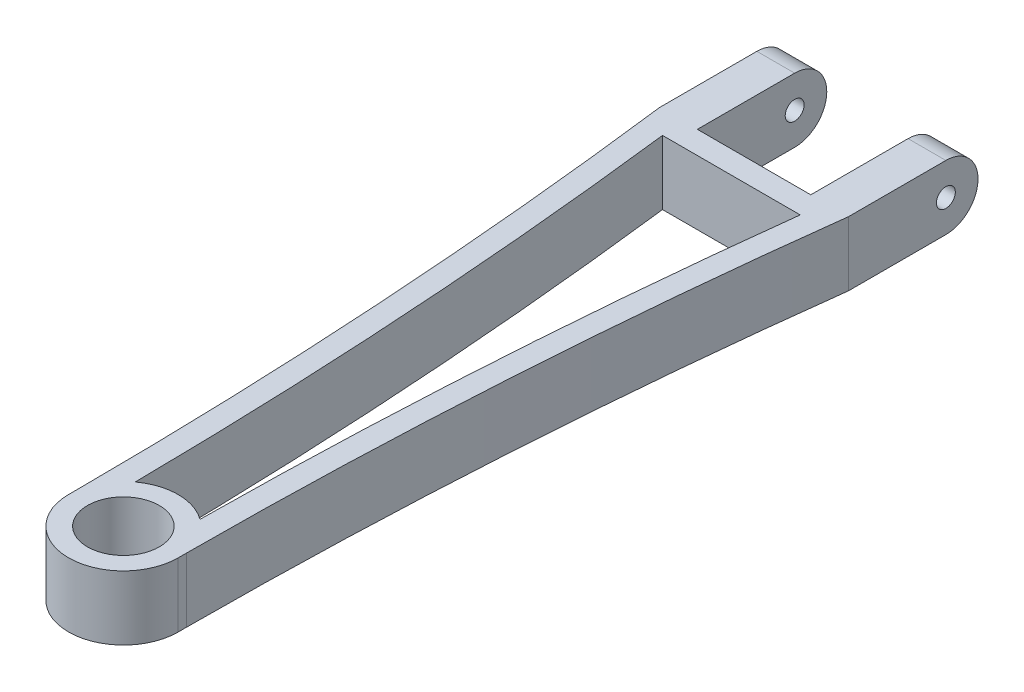
ISO-10303-21;
HEADER;
FILE_DESCRIPTION(('STEP AP214'),'2;1');
FILE_NAME('part.step','',(''),(''),'','','');
FILE_SCHEMA(('AUTOMOTIVE_DESIGN { 1 0 10303 214 1 1 1 1 }'));
ENDSEC;
DATA;
#1=APPLICATION_CONTEXT('core data for automotive mechanical design processes');
#2=APPLICATION_PROTOCOL_DEFINITION('international standard','automotive_design',2000,#1);
#3=PRODUCT_CONTEXT('',#1,'mechanical');
#4=PRODUCT('Part','Part','',(#3));
#5=PRODUCT_RELATED_PRODUCT_CATEGORY('part','',(#4));
#6=PRODUCT_DEFINITION_FORMATION('','',#4);
#7=PRODUCT_DEFINITION_CONTEXT('part definition',#1,'design');
#8=PRODUCT_DEFINITION('design','',#6,#7);
#9=PRODUCT_DEFINITION_SHAPE('','',#8);
#10=(LENGTH_UNIT() NAMED_UNIT(*) SI_UNIT(.MILLI.,.METRE.));
#11=(NAMED_UNIT(*) PLANE_ANGLE_UNIT() SI_UNIT($,.RADIAN.));
#12=(NAMED_UNIT(*) SI_UNIT($,.STERADIAN.) SOLID_ANGLE_UNIT());
#13=UNCERTAINTY_MEASURE_WITH_UNIT(LENGTH_MEASURE(1.E-05),#10,'distance_accuracy_value','');
#14=(GEOMETRIC_REPRESENTATION_CONTEXT(3) GLOBAL_UNCERTAINTY_ASSIGNED_CONTEXT((#13)) GLOBAL_UNIT_ASSIGNED_CONTEXT((#10,
#11,#12)) REPRESENTATION_CONTEXT('',''));
#15=CARTESIAN_POINT('',(0.,0.,0.));
#16=DIRECTION('',(0.,0.,1.));
#17=DIRECTION('',(1.,0.,0.));
#18=AXIS2_PLACEMENT_3D('',#15,#16,#17);
#19=CARTESIAN_POINT('',(895.939642857131,10.795,-1.02001740387436E-12));
#20=DIRECTION('',(0.,1.,0.));
#21=DIRECTION('',(0.,0.,1.));
#22=AXIS2_PLACEMENT_3D('',#19,#20,#21);
#23=PLANE('',#22);
#24=CARTESIAN_POINT('',(-1729.49833860139,10.795,1.3169458470669));
#25=DIRECTION('',(0.,1.,0.));
#26=DIRECTION('',(0.,0.,-1.));
#27=AXIS2_PLACEMENT_3D('',#24,#25,#26);
#28=CIRCLE('',#27,1711.08384539906);
#29=CARTESIAN_POINT('',(-18.419380782527,10.795,-2.77280905466768));
#30=VERTEX_POINT('',#29);
#31=CARTESIAN_POINT('',(-31.75,10.795,-211.893055705069));
#32=VERTEX_POINT('',#31);
#33=EDGE_CURVE('E216',#30,#32,#28,.T.);
#34=ORIENTED_EDGE('',*,*,#33,.F.);
#35=CARTESIAN_POINT('',(-895.939642857131,10.795,-1.02001740387436E-12));
#36=DIRECTION('',(0.,-1.,0.));
#37=DIRECTION('',(0.,0.,-1.));
#38=AXIS2_PLACEMENT_3D('',#35,#36,#37);
#39=CIRCLE('',#38,877.524642857131);
#40=CARTESIAN_POINT('',(-18.415,10.795,0.));
#41=VERTEX_POINT('',#40);
#42=EDGE_CURVE('E316',#30,#41,#39,.T.);
#43=ORIENTED_EDGE('',*,*,#42,.T.);
#44=CARTESIAN_POINT('',(0.,10.795,0.));
#45=DIRECTION('',(0.,1.,0.));
#46=DIRECTION('',(0.,0.,1.));
#47=AXIS2_PLACEMENT_3D('',#44,#45,#46);
#48=CIRCLE('',#47,18.415);
#49=CARTESIAN_POINT('',(18.415,10.795,0.));
#50=VERTEX_POINT('',#49);
#51=EDGE_CURVE('E320',#41,#50,#48,.T.);
#52=ORIENTED_EDGE('',*,*,#51,.T.);
#53=CARTESIAN_POINT('',(895.939642857131,10.795,-1.02001740387436E-12));
#54=DIRECTION('',(0.,-1.,0.));
#55=DIRECTION('',(0.,0.,1.));
#56=AXIS2_PLACEMENT_3D('',#53,#54,#55);
#57=CIRCLE('',#56,877.524642857131);
#58=CARTESIAN_POINT('',(18.4193807825269,10.795,-2.77280905466768));
#59=VERTEX_POINT('',#58);
#60=EDGE_CURVE('E312',#50,#59,#57,.T.);
#61=ORIENTED_EDGE('',*,*,#60,.T.);
#62=CARTESIAN_POINT('',(1729.49833860139,10.795,1.3169458470669));
#63=DIRECTION('',(0.,1.,0.));
#64=DIRECTION('',(0.,0.,1.));
#65=AXIS2_PLACEMENT_3D('',#62,#63,#64);
#66=CIRCLE('',#65,1711.08384539906);
#67=CARTESIAN_POINT('',(31.7499999999999,10.795,-211.893055705069));
#68=VERTEX_POINT('',#67);
#69=EDGE_CURVE('E210',#68,#59,#66,.T.);
#70=ORIENTED_EDGE('',*,*,#69,.F.);
#71=DIRECTION('',(0.,0.,1.));
#72=VECTOR('',#71,1.);
#73=CARTESIAN_POINT('',(31.75,10.795,-270.002));
#74=LINE('',#73,#72);
#75=CARTESIAN_POINT('',(31.75,10.795,-244.587495827831));
#76=VERTEX_POINT('',#75);
#77=EDGE_CURVE('E263',#76,#68,#74,.T.);
#78=ORIENTED_EDGE('',*,*,#77,.F.);
#79=DIRECTION('',(1.,0.,0.));
#80=VECTOR('',#79,1.);
#81=CARTESIAN_POINT('',(-31.75,10.795,-244.587495827831));
#82=LINE('',#81,#80);
#83=CARTESIAN_POINT('',(19.05,10.795,-244.587495827831));
#84=VERTEX_POINT('',#83);
#85=EDGE_CURVE('E251',#84,#76,#82,.T.);
#86=ORIENTED_EDGE('',*,*,#85,.F.);
#87=DIRECTION('',(0.,0.,1.));
#88=VECTOR('',#87,1.);
#89=CARTESIAN_POINT('',(19.05,10.795,-270.002));
#90=LINE('',#89,#88);
#91=CARTESIAN_POINT('',(19.05,10.795,-211.893055705069));
#92=VERTEX_POINT('',#91);
#93=EDGE_CURVE('E267',#84,#92,#90,.T.);
#94=ORIENTED_EDGE('',*,*,#93,.T.);
#95=DIRECTION('',(-1.,0.,0.));
#96=VECTOR('',#95,1.);
#97=CARTESIAN_POINT('',(31.75,10.795,-211.893055705069));
#98=LINE('',#97,#96);
#99=CARTESIAN_POINT('',(-19.05,10.795,-211.893055705069));
#100=VERTEX_POINT('',#99);
#101=EDGE_CURVE('E295',#92,#100,#98,.T.);
#102=ORIENTED_EDGE('',*,*,#101,.T.);
#103=DIRECTION('',(0.,0.,1.));
#104=VECTOR('',#103,1.);
#105=CARTESIAN_POINT('',(-19.05,10.795,-270.002));
#106=LINE('',#105,#104);
#107=CARTESIAN_POINT('',(-19.05,10.795,-244.587495827831));
#108=VERTEX_POINT('',#107);
#109=EDGE_CURVE('E277',#108,#100,#106,.T.);
#110=ORIENTED_EDGE('',*,*,#109,.F.);
#111=CARTESIAN_POINT('',(-31.75,10.795,-244.587495827831));
#112=VERTEX_POINT('',#111);
#113=EDGE_CURVE('E247',#112,#108,#82,.T.);
#114=ORIENTED_EDGE('',*,*,#113,.F.);
#115=DIRECTION('',(0.,0.,1.));
#116=VECTOR('',#115,1.);
#117=CARTESIAN_POINT('',(-31.75,10.795,-270.002));
#118=LINE('',#117,#116);
#119=EDGE_CURVE('E280',#112,#32,#118,.T.);
#120=ORIENTED_EDGE('',*,*,#119,.T.);
#121=EDGE_LOOP('',(#34,#43,#52,#61,#70,#78,#86,#94,#102,#110,#114,#120));
#122=FACE_BOUND('',#121,.T.);
#123=CARTESIAN_POINT('',(0.,10.795,0.));
#124=DIRECTION('',(0.,1.,0.));
#125=DIRECTION('',(0.,0.,1.));
#126=AXIS2_PLACEMENT_3D('',#123,#124,#125);
#127=CIRCLE('',#126,12.065);
#128=CARTESIAN_POINT('',(0.,10.795,12.065));
#129=VERTEX_POINT('',#128);
#130=EDGE_CURVE('E304',#129,#129,#127,.T.);
#131=ORIENTED_EDGE('',*,*,#130,.F.);
#132=EDGE_LOOP('',(#131));
#133=FACE_BOUND('',#132,.T.);
#134=DIRECTION('',(-1.,0.,0.));
#135=VECTOR('',#134,1.);
#136=CARTESIAN_POINT('',(0.,10.795,-204.273055705069));
#137=LINE('',#136,#135);
#138=CARTESIAN_POINT('',(23.1350538781997,10.795,-204.273055705069));
#139=VERTEX_POINT('',#138);
#140=CARTESIAN_POINT('',(-23.1350538781997,10.795,-204.273055705069));
#141=VERTEX_POINT('',#140);
#142=EDGE_CURVE('E73',#139,#141,#137,.T.);
#143=ORIENTED_EDGE('',*,*,#142,.F.);
#144=CARTESIAN_POINT('',(1729.49833860139,10.795,1.3169458470669));
#145=DIRECTION('',(0.,1.,0.));
#146=DIRECTION('',(0.,0.,1.));
#147=AXIS2_PLACEMENT_3D('',#144,#145,#146);
#148=CIRCLE('',#147,1718.70384539906);
#149=CARTESIAN_POINT('',(10.8706643842904,10.795,-14.8640802219328));
#150=VERTEX_POINT('',#149);
#151=EDGE_CURVE('E204',#139,#150,#148,.T.);
#152=ORIENTED_EDGE('',*,*,#151,.T.);
#153=CARTESIAN_POINT('',(0.,10.795,0.));
#154=DIRECTION('',(0.,1.,0.));
#155=DIRECTION('',(0.,0.,1.));
#156=AXIS2_PLACEMENT_3D('',#153,#154,#155);
#157=CIRCLE('',#156,18.4149999999982);
#158=CARTESIAN_POINT('',(-10.8706643842904,10.795,-14.8640802219328));
#159=VERTEX_POINT('',#158);
#160=EDGE_CURVE('E200',#150,#159,#157,.T.);
#161=ORIENTED_EDGE('',*,*,#160,.T.);
#162=CARTESIAN_POINT('',(-1729.49833860139,10.795,1.3169458470669));
#163=DIRECTION('',(0.,1.,0.));
#164=DIRECTION('',(0.,0.,1.));
#165=AXIS2_PLACEMENT_3D('',#162,#163,#164);
#166=CIRCLE('',#165,1718.70384539906);
#167=EDGE_CURVE('E187',#159,#141,#166,.T.);
#168=ORIENTED_EDGE('',*,*,#167,.T.);
#169=EDGE_LOOP('',(#143,#152,#161,#168));
#170=FACE_BOUND('',#169,.T.);
#171=ADVANCED_FACE('F69',(#122,#133,#170),#23,.T.);
#172=CARTESIAN_POINT('',(895.939642857131,-10.795,-1.02001740387436E-12));
#173=DIRECTION('',(0.,1.,0.));
#174=DIRECTION('',(0.,0.,1.));
#175=AXIS2_PLACEMENT_3D('',#172,#173,#174);
#176=PLANE('',#175);
#177=CARTESIAN_POINT('',(-895.939642857131,-10.795,-1.02001740387436E-12));
#178=DIRECTION('',(0.,-1.,0.));
#179=DIRECTION('',(0.,0.,-1.));
#180=AXIS2_PLACEMENT_3D('',#177,#178,#179);
#181=CIRCLE('',#180,877.524642857131);
#182=CARTESIAN_POINT('',(-18.4193807825269,-10.795,-2.77280905466768));
#183=VERTEX_POINT('',#182);
#184=CARTESIAN_POINT('',(-18.415,-10.795,0.));
#185=VERTEX_POINT('',#184);
#186=EDGE_CURVE('E327',#183,#185,#181,.T.);
#187=ORIENTED_EDGE('',*,*,#186,.F.);
#188=CARTESIAN_POINT('',(-1729.49833860139,-10.795,1.3169458470669));
#189=DIRECTION('',(0.,1.,0.));
#190=DIRECTION('',(0.,0.,-1.));
#191=AXIS2_PLACEMENT_3D('',#188,#189,#190);
#192=CIRCLE('',#191,1711.08384539906);
#193=CARTESIAN_POINT('',(-31.75,-10.795,-211.893055705069));
#194=VERTEX_POINT('',#193);
#195=EDGE_CURVE('E211',#183,#194,#192,.T.);
#196=ORIENTED_EDGE('',*,*,#195,.T.);
#197=DIRECTION('',(0.,0.,1.));
#198=VECTOR('',#197,1.);
#199=CARTESIAN_POINT('',(-31.75,-10.795,-270.002));
#200=LINE('',#199,#198);
#201=CARTESIAN_POINT('',(-31.75,-10.795,-244.587495827831));
#202=VERTEX_POINT('',#201);
#203=EDGE_CURVE('E284',#202,#194,#200,.T.);
#204=ORIENTED_EDGE('',*,*,#203,.F.);
#205=DIRECTION('',(1.,0.,0.));
#206=VECTOR('',#205,1.);
#207=CARTESIAN_POINT('',(-31.75,-10.795,-244.587495827831));
#208=LINE('',#207,#206);
#209=CARTESIAN_POINT('',(-19.05,-10.795,-244.587495827831));
#210=VERTEX_POINT('',#209);
#211=EDGE_CURVE('E252',#202,#210,#208,.T.);
#212=ORIENTED_EDGE('',*,*,#211,.T.);
#213=DIRECTION('',(0.,0.,1.));
#214=VECTOR('',#213,1.);
#215=CARTESIAN_POINT('',(-19.05,-10.795,-270.002));
#216=LINE('',#215,#214);
#217=CARTESIAN_POINT('',(-19.05,-10.795,-213.781935950594));
#218=VERTEX_POINT('',#217);
#219=EDGE_CURVE('E288',#210,#218,#216,.T.);
#220=ORIENTED_EDGE('',*,*,#219,.T.);
#221=DIRECTION('',(-1.,0.,0.));
#222=VECTOR('',#221,1.);
#223=CARTESIAN_POINT('',(31.75,-10.795,-213.781935950594));
#224=LINE('',#223,#222);
#225=CARTESIAN_POINT('',(19.05,-10.795,-213.781935950594));
#226=VERTEX_POINT('',#225);
#227=EDGE_CURVE('E291',#226,#218,#224,.T.);
#228=ORIENTED_EDGE('',*,*,#227,.F.);
#229=DIRECTION('',(0.,0.,1.));
#230=VECTOR('',#229,1.);
#231=CARTESIAN_POINT('',(19.05,-10.795,-270.002));
#232=LINE('',#231,#230);
#233=CARTESIAN_POINT('',(19.05,-10.795,-244.587495827831));
#234=VERTEX_POINT('',#233);
#235=EDGE_CURVE('E270',#234,#226,#232,.T.);
#236=ORIENTED_EDGE('',*,*,#235,.F.);
#237=CARTESIAN_POINT('',(31.75,-10.795,-244.587495827831));
#238=VERTEX_POINT('',#237);
#239=EDGE_CURVE('E246',#234,#238,#208,.T.);
#240=ORIENTED_EDGE('',*,*,#239,.T.);
#241=DIRECTION('',(0.,0.,1.));
#242=VECTOR('',#241,1.);
#243=CARTESIAN_POINT('',(31.75,-10.795,-270.002));
#244=LINE('',#243,#242);
#245=CARTESIAN_POINT('',(31.7499999999999,-10.795,-211.893055705069));
#246=VERTEX_POINT('',#245);
#247=EDGE_CURVE('E273',#238,#246,#244,.T.);
#248=ORIENTED_EDGE('',*,*,#247,.T.);
#249=CARTESIAN_POINT('',(1729.49833860139,-10.795,1.3169458470669));
#250=DIRECTION('',(0.,1.,0.));
#251=DIRECTION('',(0.,0.,1.));
#252=AXIS2_PLACEMENT_3D('',#249,#250,#251);
#253=CIRCLE('',#252,1711.08384539906);
#254=CARTESIAN_POINT('',(18.419380782527,-10.795,-2.77280905466768));
#255=VERTEX_POINT('',#254);
#256=EDGE_CURVE('E224',#246,#255,#253,.T.);
#257=ORIENTED_EDGE('',*,*,#256,.T.);
#258=CARTESIAN_POINT('',(895.939642857131,-10.795,-1.02001740387436E-12));
#259=DIRECTION('',(0.,-1.,0.));
#260=DIRECTION('',(0.,0.,1.));
#261=AXIS2_PLACEMENT_3D('',#258,#259,#260);
#262=CIRCLE('',#261,877.524642857131);
#263=CARTESIAN_POINT('',(18.415,-10.795,0.));
#264=VERTEX_POINT('',#263);
#265=EDGE_CURVE('E308',#264,#255,#262,.T.);
#266=ORIENTED_EDGE('',*,*,#265,.F.);
#267=CARTESIAN_POINT('',(0.,-10.795,0.));
#268=DIRECTION('',(0.,1.,0.));
#269=DIRECTION('',(0.,0.,1.));
#270=AXIS2_PLACEMENT_3D('',#267,#268,#269);
#271=CIRCLE('',#270,18.415);
#272=EDGE_CURVE('E317',#185,#264,#271,.T.);
#273=ORIENTED_EDGE('',*,*,#272,.F.);
#274=EDGE_LOOP('',(#187,#196,#204,#212,#220,#228,#236,#240,#248,#257,#266,#273));
#275=FACE_BOUND('',#274,.T.);
#276=CARTESIAN_POINT('',(0.,-10.795,0.));
#277=DIRECTION('',(0.,1.,0.));
#278=DIRECTION('',(0.,0.,1.));
#279=AXIS2_PLACEMENT_3D('',#276,#277,#278);
#280=CIRCLE('',#279,12.065);
#281=CARTESIAN_POINT('',(0.,-10.795,12.065));
#282=VERTEX_POINT('',#281);
#283=EDGE_CURVE('E303',#282,#282,#280,.T.);
#284=ORIENTED_EDGE('',*,*,#283,.T.);
#285=EDGE_LOOP('',(#284));
#286=FACE_BOUND('',#285,.T.);
#287=CARTESIAN_POINT('',(1729.49833860139,-10.795,1.3169458470669));
#288=DIRECTION('',(0.,1.,0.));
#289=DIRECTION('',(0.,0.,1.));
#290=AXIS2_PLACEMENT_3D('',#287,#288,#289);
#291=CIRCLE('',#290,1718.70384539906);
#292=CARTESIAN_POINT('',(23.1350538781996,-10.795,-204.273055705069));
#293=VERTEX_POINT('',#292);
#294=CARTESIAN_POINT('',(10.8706643842904,-10.795,-14.8640802219328));
#295=VERTEX_POINT('',#294);
#296=EDGE_CURVE('E469',#293,#295,#291,.T.);
#297=ORIENTED_EDGE('',*,*,#296,.F.);
#298=DIRECTION('',(-1.,0.,0.));
#299=VECTOR('',#298,1.);
#300=CARTESIAN_POINT('',(0.,-10.795,-204.273055705069));
#301=LINE('',#300,#299);
#302=CARTESIAN_POINT('',(-23.1350538781996,-10.795,-204.273055705069));
#303=VERTEX_POINT('',#302);
#304=EDGE_CURVE('E470',#293,#303,#301,.T.);
#305=ORIENTED_EDGE('',*,*,#304,.T.);
#306=CARTESIAN_POINT('',(-1729.49833860139,-10.795,1.3169458470669));
#307=DIRECTION('',(0.,1.,0.));
#308=DIRECTION('',(0.,0.,1.));
#309=AXIS2_PLACEMENT_3D('',#306,#307,#308);
#310=CIRCLE('',#309,1718.70384539906);
#311=CARTESIAN_POINT('',(-10.8706643842904,-10.795,-14.8640802219328));
#312=VERTEX_POINT('',#311);
#313=EDGE_CURVE('E194',#312,#303,#310,.T.);
#314=ORIENTED_EDGE('',*,*,#313,.F.);
#315=CARTESIAN_POINT('',(0.,-10.795,0.));
#316=DIRECTION('',(0.,1.,0.));
#317=DIRECTION('',(0.,0.,1.));
#318=AXIS2_PLACEMENT_3D('',#315,#316,#317);
#319=CIRCLE('',#318,18.4149999999982);
#320=EDGE_CURVE('E471',#295,#312,#319,.T.);
#321=ORIENTED_EDGE('',*,*,#320,.F.);
#322=EDGE_LOOP('',(#297,#305,#314,#321));
#323=FACE_BOUND('',#322,.T.);
#324=ADVANCED_FACE('F360',(#275,#286,#323),#176,.F.);
#325=CARTESIAN_POINT('',(-19.05,10.795,-270.002));
#326=DIRECTION('',(-1.,0.,0.));
#327=DIRECTION('',(0.,0.,1.));
#328=AXIS2_PLACEMENT_3D('',#325,#326,#327);
#329=PLANE('',#328);
#330=CARTESIAN_POINT('',(-19.05,0.,-244.587495827831));
#331=DIRECTION('',(-1.,0.,0.));
#332=DIRECTION('',(0.,0.,1.));
#333=AXIS2_PLACEMENT_3D('',#330,#331,#332);
#334=CIRCLE('',#333,3.175);
#335=CARTESIAN_POINT('',(-19.05,0.,-241.412495827831));
#336=VERTEX_POINT('',#335);
#337=EDGE_CURVE('E259',#336,#336,#334,.T.);
#338=ORIENTED_EDGE('',*,*,#337,.T.);
#339=EDGE_LOOP('',(#338));
#340=FACE_BOUND('',#339,.T.);
#341=CARTESIAN_POINT('',(-19.05,0.,-244.587495827831));
#342=DIRECTION('',(-1.,0.,0.));
#343=DIRECTION('',(0.,0.,1.));
#344=AXIS2_PLACEMENT_3D('',#341,#342,#343);
#345=CIRCLE('',#344,10.795);
#346=EDGE_CURVE('E250',#108,#210,#345,.T.);
#347=ORIENTED_EDGE('',*,*,#346,.F.);
#348=ORIENTED_EDGE('',*,*,#109,.T.);
#349=DIRECTION('',(0.,0.996194698091746,0.0871557427476579));
#350=VECTOR('',#349,1.);
#351=CARTESIAN_POINT('',(-19.05,-16.7951105051861,-214.3068775997));
#352=LINE('',#351,#350);
#353=EDGE_CURVE('E299',#218,#100,#352,.T.);
#354=ORIENTED_EDGE('',*,*,#353,.F.);
#355=ORIENTED_EDGE('',*,*,#219,.F.);
#356=EDGE_LOOP('',(#347,#348,#354,#355));
#357=FACE_BOUND('',#356,.T.);
#358=ADVANCED_FACE('F386',(#340,#357),#329,.F.);
#359=CARTESIAN_POINT('',(-31.75,10.795,-270.002));
#360=DIRECTION('',(1.,0.,0.));
#361=DIRECTION('',(0.,0.,-1.));
#362=AXIS2_PLACEMENT_3D('',#359,#360,#361);
#363=PLANE('',#362);
#364=CARTESIAN_POINT('',(-31.75,0.,-244.587495827831));
#365=DIRECTION('',(1.,0.,0.));
#366=DIRECTION('',(0.,0.,-1.));
#367=AXIS2_PLACEMENT_3D('',#364,#365,#366);
#368=CIRCLE('',#367,3.175);
#369=CARTESIAN_POINT('',(-31.75,0.,-247.762495827831));
#370=VERTEX_POINT('',#369);
#371=EDGE_CURVE('E235',#370,#370,#368,.T.);
#372=ORIENTED_EDGE('',*,*,#371,.T.);
#373=EDGE_LOOP('',(#372));
#374=FACE_BOUND('',#373,.T.);
#375=ORIENTED_EDGE('',*,*,#203,.T.);
#376=DIRECTION('',(0.,1.,0.));
#377=VECTOR('',#376,1.);
#378=CARTESIAN_POINT('',(-31.75,-10.795,-211.893055705069));
#379=LINE('',#378,#377);
#380=EDGE_CURVE('E215',#194,#32,#379,.T.);
#381=ORIENTED_EDGE('',*,*,#380,.T.);
#382=ORIENTED_EDGE('',*,*,#119,.F.);
#383=CARTESIAN_POINT('',(-31.75,0.,-244.587495827831));
#384=DIRECTION('',(1.,0.,0.));
#385=DIRECTION('',(0.,0.,-1.));
#386=AXIS2_PLACEMENT_3D('',#383,#384,#385);
#387=CIRCLE('',#386,10.795);
#388=EDGE_CURVE('E243',#202,#112,#387,.T.);
#389=ORIENTED_EDGE('',*,*,#388,.F.);
#390=EDGE_LOOP('',(#375,#381,#382,#389));
#391=FACE_BOUND('',#390,.T.);
#392=ADVANCED_FACE('F378',(#374,#391),#363,.F.);
#393=CARTESIAN_POINT('',(31.75,-10.795,-270.002));
#394=DIRECTION('',(-1.,0.,0.));
#395=DIRECTION('',(0.,0.,1.));
#396=AXIS2_PLACEMENT_3D('',#393,#394,#395);
#397=PLANE('',#396);
#398=CARTESIAN_POINT('',(31.75,0.,-244.587495827831));
#399=DIRECTION('',(1.,0.,0.));
#400=DIRECTION('',(0.,0.,-1.));
#401=AXIS2_PLACEMENT_3D('',#398,#399,#400);
#402=CIRCLE('',#401,3.175);
#403=CARTESIAN_POINT('',(31.75,0.,-247.762495827831));
#404=VERTEX_POINT('',#403);
#405=EDGE_CURVE('E223',#404,#404,#402,.T.);
#406=ORIENTED_EDGE('',*,*,#405,.F.);
#407=EDGE_LOOP('',(#406));
#408=FACE_BOUND('',#407,.T.);
#409=ORIENTED_EDGE('',*,*,#77,.T.);
#410=DIRECTION('',(0.,1.,0.));
#411=VECTOR('',#410,1.);
#412=CARTESIAN_POINT('',(31.7499999999999,-10.795,-211.893055705069));
#413=LINE('',#412,#411);
#414=EDGE_CURVE('E219',#246,#68,#413,.T.);
#415=ORIENTED_EDGE('',*,*,#414,.F.);
#416=ORIENTED_EDGE('',*,*,#247,.F.);
#417=CARTESIAN_POINT('',(31.75,0.,-244.587495827831));
#418=DIRECTION('',(1.,0.,0.));
#419=DIRECTION('',(0.,0.,-1.));
#420=AXIS2_PLACEMENT_3D('',#417,#418,#419);
#421=CIRCLE('',#420,10.795);
#422=EDGE_CURVE('E239',#238,#76,#421,.T.);
#423=ORIENTED_EDGE('',*,*,#422,.T.);
#424=EDGE_LOOP('',(#409,#415,#416,#423));
#425=FACE_BOUND('',#424,.T.);
#426=ADVANCED_FACE('F406',(#408,#425),#397,.F.);
#427=CARTESIAN_POINT('',(19.05,-10.795,-270.002));
#428=DIRECTION('',(1.,0.,0.));
#429=DIRECTION('',(0.,0.,-1.));
#430=AXIS2_PLACEMENT_3D('',#427,#428,#429);
#431=PLANE('',#430);
#432=CARTESIAN_POINT('',(19.05,0.,-244.587495827831));
#433=DIRECTION('',(1.,0.,0.));
#434=DIRECTION('',(0.,0.,-1.));
#435=AXIS2_PLACEMENT_3D('',#432,#433,#434);
#436=CIRCLE('',#435,3.175);
#437=CARTESIAN_POINT('',(19.05,0.,-247.762495827831));
#438=VERTEX_POINT('',#437);
#439=EDGE_CURVE('E258',#438,#438,#436,.T.);
#440=ORIENTED_EDGE('',*,*,#439,.T.);
#441=EDGE_LOOP('',(#440));
#442=FACE_BOUND('',#441,.T.);
#443=CARTESIAN_POINT('',(19.05,0.,-244.587495827831));
#444=DIRECTION('',(1.,0.,0.));
#445=DIRECTION('',(0.,0.,-1.));
#446=AXIS2_PLACEMENT_3D('',#443,#444,#445);
#447=CIRCLE('',#446,10.795);
#448=EDGE_CURVE('E343',#234,#84,#447,.T.);
#449=ORIENTED_EDGE('',*,*,#448,.F.);
#450=ORIENTED_EDGE('',*,*,#235,.T.);
#451=DIRECTION('',(0.,-0.996194698091746,-0.0871557427476579));
#452=VECTOR('',#451,1.);
#453=CARTESIAN_POINT('',(19.05,-16.7951105051861,-214.3068775997));
#454=LINE('',#453,#452);
#455=EDGE_CURVE('E339',#92,#226,#454,.T.);
#456=ORIENTED_EDGE('',*,*,#455,.F.);
#457=ORIENTED_EDGE('',*,*,#93,.F.);
#458=EDGE_LOOP('',(#449,#450,#456,#457));
#459=FACE_BOUND('',#458,.T.);
#460=ADVANCED_FACE('F397',(#442,#459),#431,.F.);
#461=CARTESIAN_POINT('',(895.939642857131,10.795,-1.02001740387436E-12));
#462=DIRECTION('',(0.,-1.,0.));
#463=DIRECTION('',(0.,0.,-1.));
#464=AXIS2_PLACEMENT_3D('',#461,#462,#463);
#465=CYLINDRICAL_SURFACE('',#464,877.524642857131);
#466=ORIENTED_EDGE('',*,*,#265,.T.);
#467=DIRECTION('',(0.,1.,0.));
#468=VECTOR('',#467,1.);
#469=CARTESIAN_POINT('',(18.419380782527,0.,-2.77280905470772));
#470=LINE('',#469,#468);
#471=EDGE_CURVE('E12',#255,#59,#470,.T.);
#472=ORIENTED_EDGE('',*,*,#471,.T.);
#473=ORIENTED_EDGE('',*,*,#60,.F.);
#474=DIRECTION('',(0.,-1.,0.));
#475=VECTOR('',#474,1.);
#476=CARTESIAN_POINT('',(18.415,10.795,0.));
#477=LINE('',#476,#475);
#478=EDGE_CURVE('E323',#50,#264,#477,.T.);
#479=ORIENTED_EDGE('',*,*,#478,.T.);
#480=EDGE_LOOP('',(#466,#472,#473,#479));
#481=FACE_BOUND('',#480,.T.);
#482=ADVANCED_FACE('F71',(#481),#465,.F.);
#483=CARTESIAN_POINT('',(-895.939642857131,10.795,-1.02001740387436E-12));
#484=DIRECTION('',(0.,-1.,0.));
#485=DIRECTION('',(0.,0.,-1.));
#486=AXIS2_PLACEMENT_3D('',#483,#484,#485);
#487=CYLINDRICAL_SURFACE('',#486,877.524642857131);
#488=ORIENTED_EDGE('',*,*,#42,.F.);
#489=DIRECTION('',(0.,1.,0.));
#490=VECTOR('',#489,1.);
#491=CARTESIAN_POINT('',(-18.419380782527,0.,-2.77280905470772));
#492=LINE('',#491,#490);
#493=EDGE_CURVE('E80',#30,#183,#492,.F.);
#494=ORIENTED_EDGE('',*,*,#493,.T.);
#495=ORIENTED_EDGE('',*,*,#186,.T.);
#496=DIRECTION('',(0.,-1.,0.));
#497=VECTOR('',#496,1.);
#498=CARTESIAN_POINT('',(-18.415,10.795,0.));
#499=LINE('',#498,#497);
#500=EDGE_CURVE('E335',#41,#185,#499,.T.);
#501=ORIENTED_EDGE('',*,*,#500,.F.);
#502=EDGE_LOOP('',(#488,#494,#495,#501));
#503=FACE_BOUND('',#502,.T.);
#504=ADVANCED_FACE('F354',(#503),#487,.F.);
#505=CARTESIAN_POINT('',(0.,10.795,0.));
#506=DIRECTION('',(0.,-1.,0.));
#507=DIRECTION('',(0.,0.,-1.));
#508=AXIS2_PLACEMENT_3D('',#505,#506,#507);
#509=CYLINDRICAL_SURFACE('',#508,18.415);
#510=ORIENTED_EDGE('',*,*,#272,.T.);
#511=ORIENTED_EDGE('',*,*,#478,.F.);
#512=ORIENTED_EDGE('',*,*,#51,.F.);
#513=ORIENTED_EDGE('',*,*,#500,.T.);
#514=EDGE_LOOP('',(#510,#511,#512,#513));
#515=FACE_BOUND('',#514,.T.);
#516=ADVANCED_FACE('F366',(#515),#509,.T.);
#517=CARTESIAN_POINT('',(0.,10.795,0.));
#518=DIRECTION('',(0.,-1.,0.));
#519=DIRECTION('',(0.,0.,-1.));
#520=AXIS2_PLACEMENT_3D('',#517,#518,#519);
#521=CYLINDRICAL_SURFACE('',#520,12.065);
#522=ORIENTED_EDGE('',*,*,#130,.T.);
#523=EDGE_LOOP('',(#522));
#524=FACE_BOUND('',#523,.T.);
#525=ORIENTED_EDGE('',*,*,#283,.F.);
#526=EDGE_LOOP('',(#525));
#527=FACE_BOUND('',#526,.T.);
#528=ADVANCED_FACE('F428',(#524,#527),#521,.F.);
#529=CARTESIAN_POINT('',(31.75,18.4794216448478,-211.220755925392));
#530=DIRECTION('',(0.,0.0871557427476579,-0.996194698091746));
#531=DIRECTION('',(0.,0.996194698091746,0.0871557427476579));
#532=AXIS2_PLACEMENT_3D('',#529,#530,#531);
#533=PLANE('',#532);
#534=ORIENTED_EDGE('',*,*,#353,.T.);
#535=ORIENTED_EDGE('',*,*,#101,.F.);
#536=ORIENTED_EDGE('',*,*,#455,.T.);
#537=ORIENTED_EDGE('',*,*,#227,.T.);
#538=EDGE_LOOP('',(#534,#535,#536,#537));
#539=FACE_BOUND('',#538,.T.);
#540=ADVANCED_FACE('F390',(#539),#533,.T.);
#541=CARTESIAN_POINT('',(-31.75,0.,-244.587495827831));
#542=DIRECTION('',(1.,0.,0.));
#543=DIRECTION('',(0.,0.,-1.));
#544=AXIS2_PLACEMENT_3D('',#541,#542,#543);
#545=CYLINDRICAL_SURFACE('',#544,10.795);
#546=ORIENTED_EDGE('',*,*,#448,.T.);
#547=ORIENTED_EDGE('',*,*,#85,.T.);
#548=ORIENTED_EDGE('',*,*,#422,.F.);
#549=ORIENTED_EDGE('',*,*,#239,.F.);
#550=EDGE_LOOP('',(#546,#547,#548,#549));
#551=FACE_BOUND('',#550,.T.);
#552=ADVANCED_FACE('F401',(#551),#545,.T.);
#553=CARTESIAN_POINT('',(-31.75,0.,-244.587495827831));
#554=DIRECTION('',(1.,0.,0.));
#555=DIRECTION('',(0.,0.,-1.));
#556=AXIS2_PLACEMENT_3D('',#553,#554,#555);
#557=CYLINDRICAL_SURFACE('',#556,3.175);
#558=ORIENTED_EDGE('',*,*,#405,.T.);
#559=EDGE_LOOP('',(#558));
#560=FACE_BOUND('',#559,.T.);
#561=ORIENTED_EDGE('',*,*,#439,.F.);
#562=EDGE_LOOP('',(#561));
#563=FACE_BOUND('',#562,.T.);
#564=ADVANCED_FACE('F459',(#560,#563),#557,.F.);
#565=ORIENTED_EDGE('',*,*,#346,.T.);
#566=ORIENTED_EDGE('',*,*,#211,.F.);
#567=ORIENTED_EDGE('',*,*,#388,.T.);
#568=ORIENTED_EDGE('',*,*,#113,.T.);
#569=EDGE_LOOP('',(#565,#566,#567,#568));
#570=FACE_BOUND('',#569,.T.);
#571=ADVANCED_FACE('F447',(#570),#545,.T.);
#572=ORIENTED_EDGE('',*,*,#371,.F.);
#573=EDGE_LOOP('',(#572));
#574=FACE_BOUND('',#573,.T.);
#575=ORIENTED_EDGE('',*,*,#337,.F.);
#576=EDGE_LOOP('',(#575));
#577=FACE_BOUND('',#576,.T.);
#578=ADVANCED_FACE('F418',(#574,#577),#557,.F.);
#579=CARTESIAN_POINT('',(-1729.49833860139,-10.795,1.3169458470669));
#580=DIRECTION('',(0.,1.,0.));
#581=DIRECTION('',(0.,0.,1.));
#582=AXIS2_PLACEMENT_3D('',#579,#580,#581);
#583=CYLINDRICAL_SURFACE('',#582,1711.08384539906);
#584=ORIENTED_EDGE('',*,*,#33,.T.);
#585=ORIENTED_EDGE('',*,*,#380,.F.);
#586=ORIENTED_EDGE('',*,*,#195,.F.);
#587=ORIENTED_EDGE('',*,*,#493,.F.);
#588=EDGE_LOOP('',(#584,#585,#586,#587));
#589=FACE_BOUND('',#588,.T.);
#590=ADVANCED_FACE('F376',(#589),#583,.F.);
#591=CARTESIAN_POINT('',(1729.49833860139,-10.795,1.3169458470669));
#592=DIRECTION('',(0.,1.,0.));
#593=DIRECTION('',(0.,0.,1.));
#594=AXIS2_PLACEMENT_3D('',#591,#592,#593);
#595=CYLINDRICAL_SURFACE('',#594,1711.08384539906);
#596=ORIENTED_EDGE('',*,*,#256,.F.);
#597=ORIENTED_EDGE('',*,*,#414,.T.);
#598=ORIENTED_EDGE('',*,*,#69,.T.);
#599=ORIENTED_EDGE('',*,*,#471,.F.);
#600=EDGE_LOOP('',(#596,#597,#598,#599));
#601=FACE_BOUND('',#600,.T.);
#602=ADVANCED_FACE('F408',(#601),#595,.F.);
#603=CARTESIAN_POINT('',(1729.49833860139,-10.795,1.3169458470669));
#604=DIRECTION('',(0.,1.,0.));
#605=DIRECTION('',(0.,0.,1.));
#606=AXIS2_PLACEMENT_3D('',#603,#604,#605);
#607=CYLINDRICAL_SURFACE('',#606,1718.70384539906);
#608=DIRECTION('',(0.,1.,0.));
#609=VECTOR('',#608,1.);
#610=CARTESIAN_POINT('',(23.1350538781996,-10.795,-204.273055705069));
#611=LINE('',#610,#609);
#612=EDGE_CURVE('E87',#293,#139,#611,.T.);
#613=ORIENTED_EDGE('',*,*,#612,.F.);
#614=ORIENTED_EDGE('',*,*,#296,.T.);
#615=DIRECTION('',(0.,1.,0.));
#616=VECTOR('',#615,1.);
#617=CARTESIAN_POINT('',(10.8706643842904,-10.795,-14.8640802219328));
#618=LINE('',#617,#616);
#619=EDGE_CURVE('E188',#295,#150,#618,.T.);
#620=ORIENTED_EDGE('',*,*,#619,.T.);
#621=ORIENTED_EDGE('',*,*,#151,.F.);
#622=EDGE_LOOP('',(#613,#614,#620,#621));
#623=FACE_BOUND('',#622,.T.);
#624=ADVANCED_FACE('F410',(#623),#607,.T.);
#625=CARTESIAN_POINT('',(0.,-10.795,0.));
#626=DIRECTION('',(0.,1.,0.));
#627=DIRECTION('',(0.,0.,1.));
#628=AXIS2_PLACEMENT_3D('',#625,#626,#627);
#629=CYLINDRICAL_SURFACE('',#628,18.4149999999982);
#630=ORIENTED_EDGE('',*,*,#619,.F.);
#631=ORIENTED_EDGE('',*,*,#320,.T.);
#632=DIRECTION('',(0.,1.,0.));
#633=VECTOR('',#632,1.);
#634=CARTESIAN_POINT('',(-10.8706643842904,-10.795,-14.8640802219328));
#635=LINE('',#634,#633);
#636=EDGE_CURVE('E197',#312,#159,#635,.T.);
#637=ORIENTED_EDGE('',*,*,#636,.T.);
#638=ORIENTED_EDGE('',*,*,#160,.F.);
#639=EDGE_LOOP('',(#630,#631,#637,#638));
#640=FACE_BOUND('',#639,.T.);
#641=ADVANCED_FACE('F416',(#640),#629,.T.);
#642=CARTESIAN_POINT('',(-1729.49833860139,-10.795,1.3169458470669));
#643=DIRECTION('',(0.,1.,0.));
#644=DIRECTION('',(0.,0.,1.));
#645=AXIS2_PLACEMENT_3D('',#642,#643,#644);
#646=CYLINDRICAL_SURFACE('',#645,1718.70384539906);
#647=ORIENTED_EDGE('',*,*,#636,.F.);
#648=ORIENTED_EDGE('',*,*,#313,.T.);
#649=DIRECTION('',(0.,1.,0.));
#650=VECTOR('',#649,1.);
#651=CARTESIAN_POINT('',(-23.1350538781996,-10.795,-204.273055705069));
#652=LINE('',#651,#650);
#653=EDGE_CURVE('E181',#303,#141,#652,.T.);
#654=ORIENTED_EDGE('',*,*,#653,.T.);
#655=ORIENTED_EDGE('',*,*,#167,.F.);
#656=EDGE_LOOP('',(#647,#648,#654,#655));
#657=FACE_BOUND('',#656,.T.);
#658=ADVANCED_FACE('F191',(#657),#646,.T.);
#659=CARTESIAN_POINT('',(0.,-10.795,-204.273055705069));
#660=DIRECTION('',(0.,0.,-1.));
#661=DIRECTION('',(-1.,0.,0.));
#662=AXIS2_PLACEMENT_3D('',#659,#660,#661);
#663=PLANE('',#662);
#664=ORIENTED_EDGE('',*,*,#142,.T.);
#665=ORIENTED_EDGE('',*,*,#653,.F.);
#666=ORIENTED_EDGE('',*,*,#304,.F.);
#667=ORIENTED_EDGE('',*,*,#612,.T.);
#668=EDGE_LOOP('',(#664,#665,#666,#667));
#669=FACE_BOUND('',#668,.T.);
#670=ADVANCED_FACE('F180',(#669),#663,.F.);
#671=CLOSED_SHELL('',(#171,#324,#358,#392,#426,#460,#482,#504,#516,#528,#540,#552,#564,#571,
#578,#590,#602,#624,#641,#658,#670));
#672=MANIFOLD_SOLID_BREP('B2',#671);
#673=ADVANCED_BREP_SHAPE_REPRESENTATION('',(#18,#672),#14);
#674=SHAPE_DEFINITION_REPRESENTATION(#9,#673);
ENDSEC;
END-ISO-10303-21;
